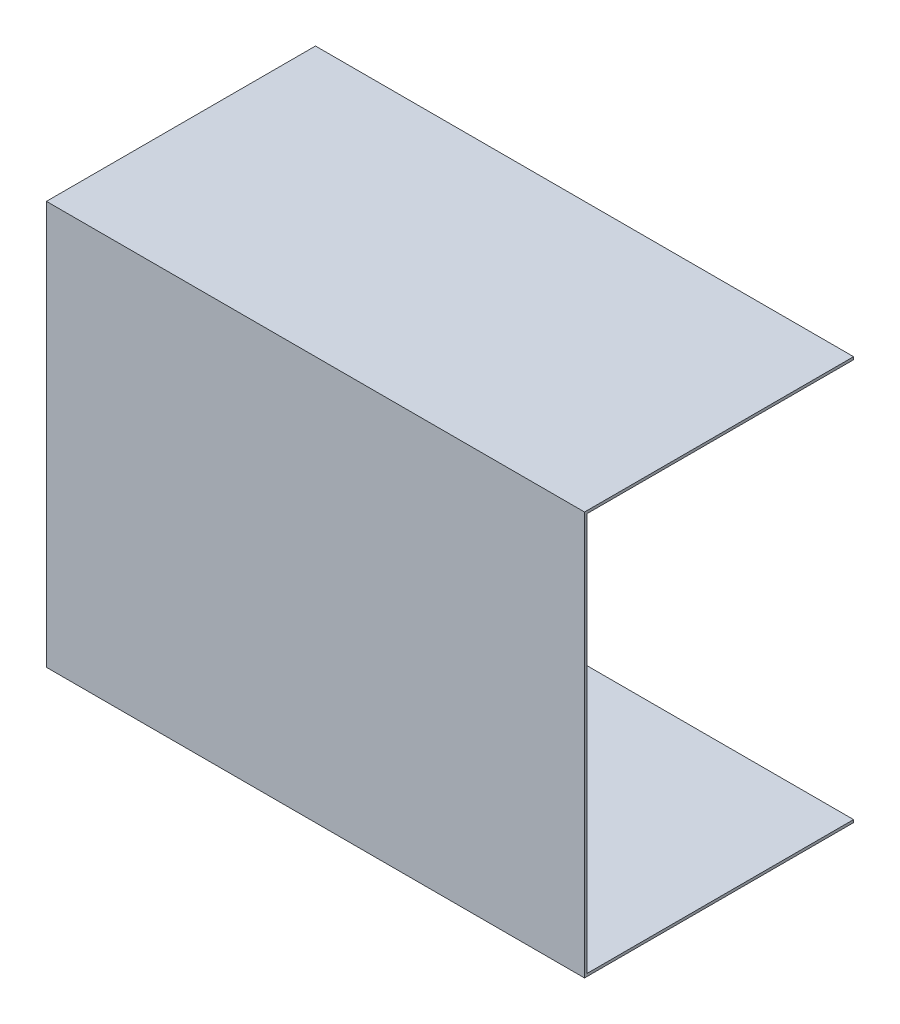
ISO-10303-21;
HEADER;
FILE_DESCRIPTION(('STEP AP214'),'2;1');
FILE_NAME('part.step','',(''),(''),'','','');
FILE_SCHEMA(('AUTOMOTIVE_DESIGN { 1 0 10303 214 1 1 1 1 }'));
ENDSEC;
DATA;
#1=APPLICATION_CONTEXT('core data for automotive mechanical design processes');
#2=APPLICATION_PROTOCOL_DEFINITION('international standard','automotive_design',2000,#1);
#3=PRODUCT_CONTEXT('',#1,'mechanical');
#4=PRODUCT('Part','Part','',(#3));
#5=PRODUCT_RELATED_PRODUCT_CATEGORY('part','',(#4));
#6=PRODUCT_DEFINITION_FORMATION('','',#4);
#7=PRODUCT_DEFINITION_CONTEXT('part definition',#1,'design');
#8=PRODUCT_DEFINITION('design','',#6,#7);
#9=PRODUCT_DEFINITION_SHAPE('','',#8);
#10=(LENGTH_UNIT() NAMED_UNIT(*) SI_UNIT(.MILLI.,.METRE.));
#11=(NAMED_UNIT(*) PLANE_ANGLE_UNIT() SI_UNIT($,.RADIAN.));
#12=(NAMED_UNIT(*) SI_UNIT($,.STERADIAN.) SOLID_ANGLE_UNIT());
#13=UNCERTAINTY_MEASURE_WITH_UNIT(LENGTH_MEASURE(1.E-05),#10,'distance_accuracy_value','');
#14=(GEOMETRIC_REPRESENTATION_CONTEXT(3) GLOBAL_UNCERTAINTY_ASSIGNED_CONTEXT((#13)) GLOBAL_UNIT_ASSIGNED_CONTEXT((#10,
#11,#12)) REPRESENTATION_CONTEXT('',''));
#15=CARTESIAN_POINT('',(0.,0.,0.));
#16=DIRECTION('',(0.,0.,1.));
#17=DIRECTION('',(1.,0.,0.));
#18=AXIS2_PLACEMENT_3D('',#15,#16,#17);
#19=CARTESIAN_POINT('',(1000.,1500.,-500.));
#20=DIRECTION('',(-1.,0.,0.));
#21=DIRECTION('',(0.,0.,1.));
#22=AXIS2_PLACEMENT_3D('',#19,#20,#21);
#23=PLANE('',#22);
#24=DIRECTION('',(0.,0.,-1.));
#25=VECTOR('',#24,1.);
#26=CARTESIAN_POINT('',(1000.,10.,-500.));
#27=LINE('',#26,#25);
#28=CARTESIAN_POINT('',(1000.,10.,490.));
#29=VERTEX_POINT('',#28);
#30=CARTESIAN_POINT('',(1000.,10.,-500.));
#31=VERTEX_POINT('',#30);
#32=EDGE_CURVE('E142',#29,#31,#27,.T.);
#33=ORIENTED_EDGE('',*,*,#32,.F.);
#34=DIRECTION('',(0.,-1.,0.));
#35=VECTOR('',#34,1.);
#36=CARTESIAN_POINT('',(1000.,1500.,490.));
#37=LINE('',#36,#35);
#38=CARTESIAN_POINT('',(1000.,1490.,490.));
#39=VERTEX_POINT('',#38);
#40=EDGE_CURVE('E123',#39,#29,#37,.T.);
#41=ORIENTED_EDGE('',*,*,#40,.F.);
#42=DIRECTION('',(0.,0.,-1.));
#43=VECTOR('',#42,1.);
#44=CARTESIAN_POINT('',(1000.,1490.,-500.));
#45=LINE('',#44,#43);
#46=CARTESIAN_POINT('',(1000.,1490.,-500.));
#47=VERTEX_POINT('',#46);
#48=EDGE_CURVE('E128',#39,#47,#45,.T.);
#49=ORIENTED_EDGE('',*,*,#48,.T.);
#50=DIRECTION('',(0.,-1.,0.));
#51=VECTOR('',#50,1.);
#52=CARTESIAN_POINT('',(1000.,1500.,-500.));
#53=LINE('',#52,#51);
#54=CARTESIAN_POINT('',(1000.,1500.,-500.));
#55=VERTEX_POINT('',#54);
#56=EDGE_CURVE('E11',#55,#47,#53,.T.);
#57=ORIENTED_EDGE('',*,*,#56,.F.);
#58=DIRECTION('',(0.,0.,-1.));
#59=VECTOR('',#58,1.);
#60=CARTESIAN_POINT('',(1000.,1500.,-500.));
#61=LINE('',#60,#59);
#62=CARTESIAN_POINT('',(1000.,1500.,500.));
#63=VERTEX_POINT('',#62);
#64=EDGE_CURVE('E145',#63,#55,#61,.T.);
#65=ORIENTED_EDGE('',*,*,#64,.F.);
#66=DIRECTION('',(0.,-1.,0.));
#67=VECTOR('',#66,1.);
#68=CARTESIAN_POINT('',(1000.,1500.,500.));
#69=LINE('',#68,#67);
#70=CARTESIAN_POINT('',(1000.,0.,500.));
#71=VERTEX_POINT('',#70);
#72=EDGE_CURVE('E151',#63,#71,#69,.T.);
#73=ORIENTED_EDGE('',*,*,#72,.T.);
#74=DIRECTION('',(0.,0.,-1.));
#75=VECTOR('',#74,1.);
#76=CARTESIAN_POINT('',(1000.,0.,-500.));
#77=LINE('',#76,#75);
#78=CARTESIAN_POINT('',(1000.,0.,-500.));
#79=VERTEX_POINT('',#78);
#80=EDGE_CURVE('E138',#71,#79,#77,.T.);
#81=ORIENTED_EDGE('',*,*,#80,.T.);
#82=EDGE_CURVE('E42',#31,#79,#53,.T.);
#83=ORIENTED_EDGE('',*,*,#82,.F.);
#84=EDGE_LOOP('',(#33,#41,#49,#57,#65,#73,#81,#83));
#85=FACE_BOUND('',#84,.T.);
#86=ADVANCED_FACE('F35',(#85),#23,.F.);
#87=CARTESIAN_POINT('',(-1000.,1500.,-500.));
#88=DIRECTION('',(0.,0.,1.));
#89=DIRECTION('',(1.,0.,0.));
#90=AXIS2_PLACEMENT_3D('',#87,#88,#89);
#91=PLANE('',#90);
#92=DIRECTION('',(-1.,0.,0.));
#93=VECTOR('',#92,1.);
#94=CARTESIAN_POINT('',(-1000.,10.,-500.));
#95=LINE('',#94,#93);
#96=CARTESIAN_POINT('',(-990.,10.,-500.));
#97=VERTEX_POINT('',#96);
#98=EDGE_CURVE('E114',#31,#97,#95,.T.);
#99=ORIENTED_EDGE('',*,*,#98,.F.);
#100=ORIENTED_EDGE('',*,*,#82,.T.);
#101=DIRECTION('',(-1.,0.,0.));
#102=VECTOR('',#101,1.);
#103=CARTESIAN_POINT('',(-1000.,0.,-500.));
#104=LINE('',#103,#102);
#105=CARTESIAN_POINT('',(-1000.,0.,-500.));
#106=VERTEX_POINT('',#105);
#107=EDGE_CURVE('E154',#79,#106,#104,.T.);
#108=ORIENTED_EDGE('',*,*,#107,.T.);
#109=DIRECTION('',(0.,-1.,0.));
#110=VECTOR('',#109,1.);
#111=CARTESIAN_POINT('',(-1000.,1500.,-500.));
#112=LINE('',#111,#110);
#113=CARTESIAN_POINT('',(-1000.,1500.,-500.));
#114=VERTEX_POINT('',#113);
#115=EDGE_CURVE('E161',#114,#106,#112,.T.);
#116=ORIENTED_EDGE('',*,*,#115,.F.);
#117=DIRECTION('',(-1.,0.,0.));
#118=VECTOR('',#117,1.);
#119=CARTESIAN_POINT('',(-1000.,1500.,-500.));
#120=LINE('',#119,#118);
#121=EDGE_CURVE('E86',#55,#114,#120,.T.);
#122=ORIENTED_EDGE('',*,*,#121,.F.);
#123=ORIENTED_EDGE('',*,*,#56,.T.);
#124=DIRECTION('',(-1.,0.,0.));
#125=VECTOR('',#124,1.);
#126=CARTESIAN_POINT('',(-1000.,1490.,-500.));
#127=LINE('',#126,#125);
#128=CARTESIAN_POINT('',(-990.,1490.,-500.));
#129=VERTEX_POINT('',#128);
#130=EDGE_CURVE('E131',#47,#129,#127,.T.);
#131=ORIENTED_EDGE('',*,*,#130,.T.);
#132=DIRECTION('',(0.,-1.,0.));
#133=VECTOR('',#132,1.);
#134=CARTESIAN_POINT('',(-990.,1500.,-500.));
#135=LINE('',#134,#133);
#136=EDGE_CURVE('E122',#129,#97,#135,.T.);
#137=ORIENTED_EDGE('',*,*,#136,.T.);
#138=EDGE_LOOP('',(#99,#100,#108,#116,#122,#123,#131,#137));
#139=FACE_BOUND('',#138,.T.);
#140=ADVANCED_FACE('F168',(#139),#91,.F.);
#141=CARTESIAN_POINT('',(-1000.,1500.,-500.));
#142=DIRECTION('',(1.,0.,0.));
#143=DIRECTION('',(0.,0.,-1.));
#144=AXIS2_PLACEMENT_3D('',#141,#142,#143);
#145=PLANE('',#144);
#146=DIRECTION('',(0.,0.,1.));
#147=VECTOR('',#146,1.);
#148=CARTESIAN_POINT('',(-1000.,0.,-500.));
#149=LINE('',#148,#147);
#150=CARTESIAN_POINT('',(-1000.,0.,500.));
#151=VERTEX_POINT('',#150);
#152=EDGE_CURVE('E156',#106,#151,#149,.T.);
#153=ORIENTED_EDGE('',*,*,#152,.T.);
#154=DIRECTION('',(0.,-1.,0.));
#155=VECTOR('',#154,1.);
#156=CARTESIAN_POINT('',(-1000.,1500.,500.));
#157=LINE('',#156,#155);
#158=CARTESIAN_POINT('',(-1000.,1500.,500.));
#159=VERTEX_POINT('',#158);
#160=EDGE_CURVE('E160',#159,#151,#157,.T.);
#161=ORIENTED_EDGE('',*,*,#160,.F.);
#162=DIRECTION('',(0.,0.,1.));
#163=VECTOR('',#162,1.);
#164=CARTESIAN_POINT('',(-1000.,1500.,-500.));
#165=LINE('',#164,#163);
#166=EDGE_CURVE('E148',#114,#159,#165,.T.);
#167=ORIENTED_EDGE('',*,*,#166,.F.);
#168=ORIENTED_EDGE('',*,*,#115,.T.);
#169=EDGE_LOOP('',(#153,#161,#167,#168));
#170=FACE_BOUND('',#169,.T.);
#171=ADVANCED_FACE('F177',(#170),#145,.F.);
#172=CARTESIAN_POINT('',(-1000.,1500.,500.));
#173=DIRECTION('',(0.,0.,-1.));
#174=DIRECTION('',(-1.,0.,0.));
#175=AXIS2_PLACEMENT_3D('',#172,#173,#174);
#176=PLANE('',#175);
#177=DIRECTION('',(1.,0.,0.));
#178=VECTOR('',#177,1.);
#179=CARTESIAN_POINT('',(-1000.,0.,500.));
#180=LINE('',#179,#178);
#181=EDGE_CURVE('E79',#151,#71,#180,.T.);
#182=ORIENTED_EDGE('',*,*,#181,.T.);
#183=ORIENTED_EDGE('',*,*,#72,.F.);
#184=DIRECTION('',(1.,0.,0.));
#185=VECTOR('',#184,1.);
#186=CARTESIAN_POINT('',(-1000.,1500.,500.));
#187=LINE('',#186,#185);
#188=EDGE_CURVE('E58',#159,#63,#187,.T.);
#189=ORIENTED_EDGE('',*,*,#188,.F.);
#190=ORIENTED_EDGE('',*,*,#160,.T.);
#191=EDGE_LOOP('',(#182,#183,#189,#190));
#192=FACE_BOUND('',#191,.T.);
#193=ADVANCED_FACE('F175',(#192),#176,.F.);
#194=CARTESIAN_POINT('',(0.,1500.,0.));
#195=DIRECTION('',(0.,1.,0.));
#196=DIRECTION('',(0.,0.,1.));
#197=AXIS2_PLACEMENT_3D('',#194,#195,#196);
#198=PLANE('',#197);
#199=ORIENTED_EDGE('',*,*,#64,.T.);
#200=ORIENTED_EDGE('',*,*,#121,.T.);
#201=ORIENTED_EDGE('',*,*,#166,.T.);
#202=ORIENTED_EDGE('',*,*,#188,.T.);
#203=EDGE_LOOP('',(#199,#200,#201,#202));
#204=FACE_BOUND('',#203,.T.);
#205=ADVANCED_FACE('F178',(#204),#198,.T.);
#206=CARTESIAN_POINT('',(0.,0.,0.));
#207=DIRECTION('',(0.,1.,0.));
#208=DIRECTION('',(0.,0.,1.));
#209=AXIS2_PLACEMENT_3D('',#206,#207,#208);
#210=PLANE('',#209);
#211=ORIENTED_EDGE('',*,*,#80,.F.);
#212=ORIENTED_EDGE('',*,*,#181,.F.);
#213=ORIENTED_EDGE('',*,*,#152,.F.);
#214=ORIENTED_EDGE('',*,*,#107,.F.);
#215=EDGE_LOOP('',(#211,#212,#213,#214));
#216=FACE_BOUND('',#215,.T.);
#217=ADVANCED_FACE('F172',(#216),#210,.F.);
#218=CARTESIAN_POINT('',(-990.,1500.,-500.));
#219=DIRECTION('',(1.,0.,0.));
#220=DIRECTION('',(0.,0.,-1.));
#221=AXIS2_PLACEMENT_3D('',#218,#219,#220);
#222=PLANE('',#221);
#223=DIRECTION('',(0.,0.,1.));
#224=VECTOR('',#223,1.);
#225=CARTESIAN_POINT('',(-990.,10.,-500.));
#226=LINE('',#225,#224);
#227=CARTESIAN_POINT('',(-990.,10.,490.));
#228=VERTEX_POINT('',#227);
#229=EDGE_CURVE('E107',#97,#228,#226,.T.);
#230=ORIENTED_EDGE('',*,*,#229,.F.);
#231=ORIENTED_EDGE('',*,*,#136,.F.);
#232=DIRECTION('',(0.,0.,1.));
#233=VECTOR('',#232,1.);
#234=CARTESIAN_POINT('',(-990.,1490.,-500.));
#235=LINE('',#234,#233);
#236=CARTESIAN_POINT('',(-990.,1490.,490.));
#237=VERTEX_POINT('',#236);
#238=EDGE_CURVE('E49',#129,#237,#235,.T.);
#239=ORIENTED_EDGE('',*,*,#238,.T.);
#240=DIRECTION('',(0.,-1.,0.));
#241=VECTOR('',#240,1.);
#242=CARTESIAN_POINT('',(-990.,1500.,490.));
#243=LINE('',#242,#241);
#244=EDGE_CURVE('E119',#237,#228,#243,.T.);
#245=ORIENTED_EDGE('',*,*,#244,.T.);
#246=EDGE_LOOP('',(#230,#231,#239,#245));
#247=FACE_BOUND('',#246,.T.);
#248=ADVANCED_FACE('F120',(#247),#222,.T.);
#249=CARTESIAN_POINT('',(-1000.,1500.,490.));
#250=DIRECTION('',(0.,0.,-1.));
#251=DIRECTION('',(-1.,0.,0.));
#252=AXIS2_PLACEMENT_3D('',#249,#250,#251);
#253=PLANE('',#252);
#254=DIRECTION('',(1.,0.,0.));
#255=VECTOR('',#254,1.);
#256=CARTESIAN_POINT('',(-1000.,10.,490.));
#257=LINE('',#256,#255);
#258=EDGE_CURVE('E111',#228,#29,#257,.T.);
#259=ORIENTED_EDGE('',*,*,#258,.F.);
#260=ORIENTED_EDGE('',*,*,#244,.F.);
#261=DIRECTION('',(1.,0.,0.));
#262=VECTOR('',#261,1.);
#263=CARTESIAN_POINT('',(-1000.,1490.,490.));
#264=LINE('',#263,#262);
#265=EDGE_CURVE('E135',#237,#39,#264,.T.);
#266=ORIENTED_EDGE('',*,*,#265,.T.);
#267=ORIENTED_EDGE('',*,*,#40,.T.);
#268=EDGE_LOOP('',(#259,#260,#266,#267));
#269=FACE_BOUND('',#268,.T.);
#270=ADVANCED_FACE('F125',(#269),#253,.T.);
#271=CARTESIAN_POINT('',(0.,1490.,0.));
#272=DIRECTION('',(0.,1.,0.));
#273=DIRECTION('',(0.,0.,1.));
#274=AXIS2_PLACEMENT_3D('',#271,#272,#273);
#275=PLANE('',#274);
#276=ORIENTED_EDGE('',*,*,#48,.F.);
#277=ORIENTED_EDGE('',*,*,#265,.F.);
#278=ORIENTED_EDGE('',*,*,#238,.F.);
#279=ORIENTED_EDGE('',*,*,#130,.F.);
#280=EDGE_LOOP('',(#276,#277,#278,#279));
#281=FACE_BOUND('',#280,.T.);
#282=ADVANCED_FACE('F180',(#281),#275,.F.);
#283=CARTESIAN_POINT('',(0.,10.,0.));
#284=DIRECTION('',(0.,1.,0.));
#285=DIRECTION('',(0.,0.,1.));
#286=AXIS2_PLACEMENT_3D('',#283,#284,#285);
#287=PLANE('',#286);
#288=ORIENTED_EDGE('',*,*,#32,.T.);
#289=ORIENTED_EDGE('',*,*,#98,.T.);
#290=ORIENTED_EDGE('',*,*,#229,.T.);
#291=ORIENTED_EDGE('',*,*,#258,.T.);
#292=EDGE_LOOP('',(#288,#289,#290,#291));
#293=FACE_BOUND('',#292,.T.);
#294=ADVANCED_FACE('F109',(#293),#287,.T.);
#295=CLOSED_SHELL('',(#86,#140,#171,#193,#205,#217,#248,#270,#282,#294));
#296=MANIFOLD_SOLID_BREP('B2',#295);
#297=ADVANCED_BREP_SHAPE_REPRESENTATION('',(#18,#296),#14);
#298=SHAPE_DEFINITION_REPRESENTATION(#9,#297);
ENDSEC;
END-ISO-10303-21;
